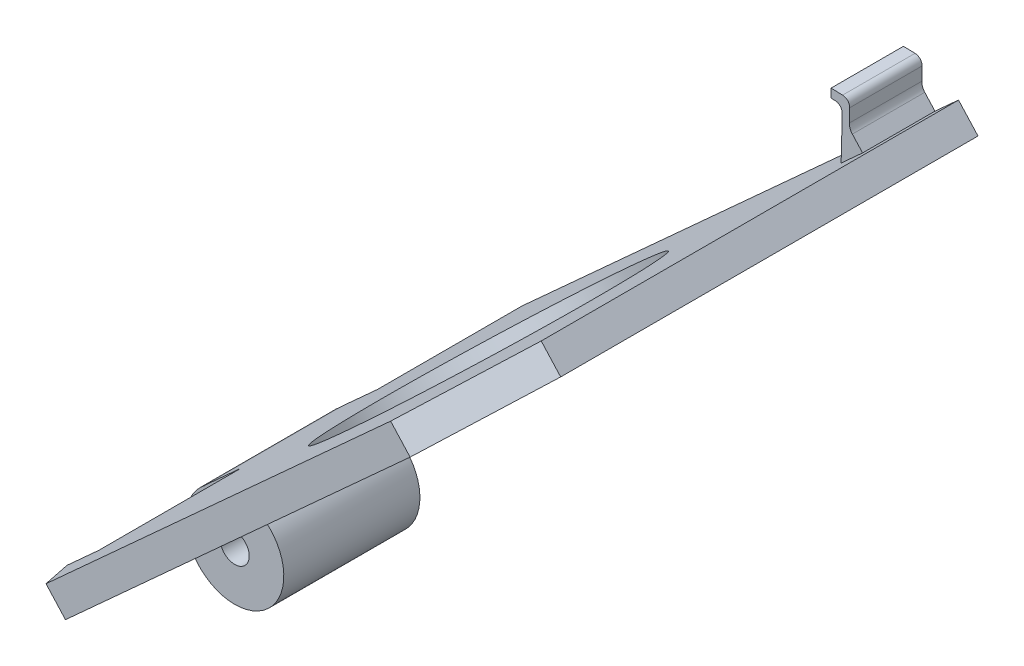
ISO-10303-21;
HEADER;
FILE_DESCRIPTION(('STEP AP214'),'2;1');
FILE_NAME('part.step','',(''),(''),'','','');
FILE_SCHEMA(('AUTOMOTIVE_DESIGN { 1 0 10303 214 1 1 1 1 }'));
ENDSEC;
DATA;
#1=APPLICATION_CONTEXT('core data for automotive mechanical design processes');
#2=APPLICATION_PROTOCOL_DEFINITION('international standard','automotive_design',2000,#1);
#3=PRODUCT_CONTEXT('',#1,'mechanical');
#4=PRODUCT('Part','Part','',(#3));
#5=PRODUCT_RELATED_PRODUCT_CATEGORY('part','',(#4));
#6=PRODUCT_DEFINITION_FORMATION('','',#4);
#7=PRODUCT_DEFINITION_CONTEXT('part definition',#1,'design');
#8=PRODUCT_DEFINITION('design','',#6,#7);
#9=PRODUCT_DEFINITION_SHAPE('','',#8);
#10=(LENGTH_UNIT() NAMED_UNIT(*) SI_UNIT(.MILLI.,.METRE.));
#11=(NAMED_UNIT(*) PLANE_ANGLE_UNIT() SI_UNIT($,.RADIAN.));
#12=(NAMED_UNIT(*) SI_UNIT($,.STERADIAN.) SOLID_ANGLE_UNIT());
#13=UNCERTAINTY_MEASURE_WITH_UNIT(LENGTH_MEASURE(1.E-05),#10,'distance_accuracy_value','');
#14=(GEOMETRIC_REPRESENTATION_CONTEXT(3) GLOBAL_UNCERTAINTY_ASSIGNED_CONTEXT((#13)) GLOBAL_UNIT_ASSIGNED_CONTEXT((#10,
#11,#12)) REPRESENTATION_CONTEXT('',''));
#15=CARTESIAN_POINT('',(0.,0.,0.));
#16=DIRECTION('',(0.,0.,1.));
#17=DIRECTION('',(1.,0.,0.));
#18=AXIS2_PLACEMENT_3D('',#15,#16,#17);
#19=CARTESIAN_POINT('',(-71.3911356861179,50.5461681079107,-19.1470894250645));
#20=DIRECTION('',(0.523355999806356,0.475498157164348,0.707106781186546));
#21=DIRECTION('',(0.803789182762831,0.,-0.594914237242193));
#22=AXIS2_PLACEMENT_3D('',#19,#20,#21);
#23=PLANE('',#22);
#24=DIRECTION('',(-0.523355999806354,-0.475498157164346,0.707106781186549));
#25=VECTOR('',#24,1.);
#26=CARTESIAN_POINT('',(-70.0462238006275,49.0658938021597,-19.1470894250645));
#27=LINE('',#26,#25);
#28=CARTESIAN_POINT('',(-70.0462238006275,49.0658938021597,-19.1470894250645));
#29=VERTEX_POINT('',#28);
#30=CARTESIAN_POINT('',(-74.4693606654794,45.0472269121251,-13.1709850670171));
#31=VERTEX_POINT('',#30);
#32=EDGE_CURVE('E288',#29,#31,#27,.T.);
#33=ORIENTED_EDGE('',*,*,#32,.F.);
#34=DIRECTION('',(0.672455942745233,-0.740137152875478,0.));
#35=VECTOR('',#34,1.);
#36=CARTESIAN_POINT('',(-71.3911356861179,50.5461681079107,-19.1470894250645));
#37=LINE('',#36,#35);
#38=CARTESIAN_POINT('',(-71.3911356861179,50.5461681079107,-19.1470894250645));
#39=VERTEX_POINT('',#38);
#40=EDGE_CURVE('E40',#39,#29,#37,.T.);
#41=ORIENTED_EDGE('',*,*,#40,.F.);
#42=DIRECTION('',(-0.523355999806354,-0.475498157164346,0.707106781186549));
#43=VECTOR('',#42,1.);
#44=CARTESIAN_POINT('',(-71.3911356861179,50.5461681079107,-19.1470894250645));
#45=LINE('',#44,#43);
#46=CARTESIAN_POINT('',(-75.8142725509698,46.5275012178761,-13.1709850670171));
#47=VERTEX_POINT('',#46);
#48=EDGE_CURVE('E289',#39,#47,#45,.T.);
#49=ORIENTED_EDGE('',*,*,#48,.T.);
#50=DIRECTION('',(0.672455942745233,-0.740137152875478,0.));
#51=VECTOR('',#50,1.);
#52=CARTESIAN_POINT('',(-75.8142725509698,46.5275012178761,-13.1709850670171));
#53=LINE('',#52,#51);
#54=EDGE_CURVE('E323',#47,#31,#53,.T.);
#55=ORIENTED_EDGE('',*,*,#54,.T.);
#56=EDGE_LOOP('',(#33,#41,#49,#55));
#57=FACE_BOUND('',#56,.T.);
#58=ADVANCED_FACE('F33',(#57),#23,.T.);
#59=CARTESIAN_POINT('',(-71.3911356861203,50.5461681079085,-47.9709850670171));
#60=DIRECTION('',(0.740137152875478,0.672455942745233,-1.11638256349546E-13));
#61=DIRECTION('',(-0.672455942745233,0.740137152875478,0.));
#62=AXIS2_PLACEMENT_3D('',#59,#60,#61);
#63=PLANE('',#62);
#64=DIRECTION('',(0.,0.,1.));
#65=VECTOR('',#64,1.);
#66=CARTESIAN_POINT('',(-70.0462238006298,49.0658938021576,-47.9709850670171));
#67=LINE('',#66,#65);
#68=CARTESIAN_POINT('',(-70.0462238006298,49.0658938021576,-47.9709850670171));
#69=VERTEX_POINT('',#68);
#70=EDGE_CURVE('E293',#69,#29,#67,.T.);
#71=ORIENTED_EDGE('',*,*,#70,.F.);
#72=DIRECTION('',(0.672455942745233,-0.740137152875478,0.));
#73=VECTOR('',#72,1.);
#74=CARTESIAN_POINT('',(-71.3911356861203,50.5461681079085,-47.9709850670171));
#75=LINE('',#74,#73);
#76=CARTESIAN_POINT('',(-71.3911356861203,50.5461681079085,-47.9709850670171));
#77=VERTEX_POINT('',#76);
#78=EDGE_CURVE('E351',#77,#69,#75,.T.);
#79=ORIENTED_EDGE('',*,*,#78,.F.);
#80=DIRECTION('',(0.,0.,1.));
#81=VECTOR('',#80,1.);
#82=CARTESIAN_POINT('',(-71.3911356861203,50.5461681079085,-47.9709850670171));
#83=LINE('',#82,#81);
#84=EDGE_CURVE('E320',#77,#39,#83,.T.);
#85=ORIENTED_EDGE('',*,*,#84,.T.);
#86=ORIENTED_EDGE('',*,*,#40,.T.);
#87=EDGE_LOOP('',(#71,#79,#85,#86));
#88=FACE_BOUND('',#87,.T.);
#89=ADVANCED_FACE('F383',(#88),#63,.T.);
#90=CARTESIAN_POINT('',(-101.532219690444,23.161309800572,-47.9709850670126));
#91=DIRECTION('',(0.,0.,-1.));
#92=DIRECTION('',(-1.,0.,0.));
#93=AXIS2_PLACEMENT_3D('',#90,#91,#92);
#94=PLANE('',#93);
#95=DIRECTION('',(0.740137152875478,0.672455942745233,-1.1126453729555E-13));
#96=VECTOR('',#95,1.);
#97=CARTESIAN_POINT('',(-100.187307804953,21.681035494821,-47.9709850670126));
#98=LINE('',#97,#96);
#99=CARTESIAN_POINT('',(-100.187307804953,21.681035494821,-47.9709850670126));
#100=VERTEX_POINT('',#99);
#101=EDGE_CURVE('E345',#100,#69,#98,.T.);
#102=ORIENTED_EDGE('',*,*,#101,.F.);
#103=DIRECTION('',(0.672455942745233,-0.740137152875478,0.));
#104=VECTOR('',#103,1.);
#105=CARTESIAN_POINT('',(-101.532219690444,23.161309800572,-47.9709850670126));
#106=LINE('',#105,#104);
#107=CARTESIAN_POINT('',(-101.532219690444,23.161309800572,-47.9709850670126));
#108=VERTEX_POINT('',#107);
#109=EDGE_CURVE('E353',#108,#100,#106,.T.);
#110=ORIENTED_EDGE('',*,*,#109,.F.);
#111=DIRECTION('',(0.740137152875478,0.672455942745233,-1.1126453729555E-13));
#112=VECTOR('',#111,1.);
#113=CARTESIAN_POINT('',(-101.532219690444,23.161309800572,-47.9709850670126));
#114=LINE('',#113,#112);
#115=CARTESIAN_POINT('',(-74.4997117281973,47.7218531483786,-47.9709850670233));
#116=VERTEX_POINT('',#115);
#117=EDGE_CURVE('E317',#108,#116,#114,.T.);
#118=ORIENTED_EDGE('',*,*,#117,.T.);
#119=DIRECTION('',(0.0255116980277722,0.999674523664447,-1.10392128959092E-13));
#120=VECTOR('',#119,1.);
#121=CARTESIAN_POINT('',(-74.422739733505,50.7379966463848,-47.9709850670236));
#122=LINE('',#121,#120);
#123=CARTESIAN_POINT('',(-74.422739733505,50.7379966463848,-47.9709850670236));
#124=VERTEX_POINT('',#123);
#125=EDGE_CURVE('E208',#116,#124,#122,.T.);
#126=ORIENTED_EDGE('',*,*,#125,.T.);
#127=CARTESIAN_POINT('',(-74.9225769953372,50.7507524953987,-47.9709850670236));
#128=DIRECTION('',(0.,1.10242506457938E-13,1.));
#129=DIRECTION('',(0.,1.,-1.10242506457938E-13));
#130=AXIS2_PLACEMENT_3D('',#127,#128,#129);
#131=CIRCLE('',#130,0.499999999999994);
#132=CARTESIAN_POINT('',(-74.9098211463233,51.2505897572309,-47.9709850670237));
#133=VERTEX_POINT('',#132);
#134=EDGE_CURVE('E233',#124,#133,#131,.T.);
#135=ORIENTED_EDGE('',*,*,#134,.T.);
#136=DIRECTION('',(-0.99967452366445,0.0255116980276584,0.));
#137=VECTOR('',#136,1.);
#138=CARTESIAN_POINT('',(-75.2099838844911,51.2582499115652,-47.9709850670237));
#139=LINE('',#138,#137);
#140=CARTESIAN_POINT('',(-75.2099838844911,51.2582499115652,-47.9709850670237));
#141=VERTEX_POINT('',#140);
#142=EDGE_CURVE('E187',#133,#141,#139,.T.);
#143=ORIENTED_EDGE('',*,*,#142,.T.);
#144=DIRECTION('',(0.0255116980277771,0.999674523664447,-1.04049531872198E-13));
#145=VECTOR('',#144,1.);
#146=CARTESIAN_POINT('',(-75.19467188198,51.8582499115652,-47.9709850670237));
#147=LINE('',#146,#145);
#148=CARTESIAN_POINT('',(-75.19467188198,51.8582499115652,-47.9709850670237));
#149=VERTEX_POINT('',#148);
#150=EDGE_CURVE('E236',#141,#149,#147,.T.);
#151=ORIENTED_EDGE('',*,*,#150,.T.);
#152=DIRECTION('',(0.999674523664448,-0.02551169802776,0.));
#153=VECTOR('',#152,1.);
#154=CARTESIAN_POINT('',(-74.39467188198,51.837833908217,-47.9709850670237));
#155=LINE('',#154,#153);
#156=CARTESIAN_POINT('',(-74.39467188198,51.837833908217,-47.9709850670237));
#157=VERTEX_POINT('',#156);
#158=EDGE_CURVE('E239',#149,#157,#155,.T.);
#159=ORIENTED_EDGE('',*,*,#158,.T.);
#160=CARTESIAN_POINT('',(-74.4074277309938,51.3379966463848,-47.9709850670237));
#161=DIRECTION('',(0.,-1.10242506457938E-13,-1.));
#162=DIRECTION('',(0.,-1.,1.10242506457938E-13));
#163=AXIS2_PLACEMENT_3D('',#160,#161,#162);
#164=CIRCLE('',#163,0.499999999999977);
#165=CARTESIAN_POINT('',(-73.9075904691616,51.3252407973709,-47.9709850670237));
#166=VERTEX_POINT('',#165);
#167=EDGE_CURVE('E242',#157,#166,#164,.T.);
#168=ORIENTED_EDGE('',*,*,#167,.T.);
#169=DIRECTION('',(-0.0255116980277735,-0.999674523664447,1.12473745506929E-13));
#170=VECTOR('',#169,1.);
#171=CARTESIAN_POINT('',(-73.9311990408944,50.4001401758593,-47.9709850670236));
#172=LINE('',#171,#170);
#173=CARTESIAN_POINT('',(-73.9311990408944,50.4001401758593,-47.9709850670236));
#174=VERTEX_POINT('',#173);
#175=EDGE_CURVE('E245',#166,#174,#172,.T.);
#176=ORIENTED_EDGE('',*,*,#175,.T.);
#177=CARTESIAN_POINT('',(-73.1314594219628,50.3797308174371,-47.9709850670236));
#178=DIRECTION('',(0.,1.10242506457938E-13,1.));
#179=DIRECTION('',(0.,1.,-1.10242506457938E-13));
#180=AXIS2_PLACEMENT_3D('',#177,#178,#179);
#181=CIRCLE('',#180,0.800000000000003);
#182=CARTESIAN_POINT('',(-73.7235691442632,49.8417660632409,-47.9709850670235));
#183=VERTEX_POINT('',#182);
#184=EDGE_CURVE('E248',#174,#183,#181,.T.);
#185=ORIENTED_EDGE('',*,*,#184,.T.);
#186=DIRECTION('',(0.672455942745235,-0.740137152875477,0.));
#187=VECTOR('',#186,1.);
#188=CARTESIAN_POINT('',(-73.7235691442632,49.8417660632409,-47.9709850670235));
#189=LINE('',#188,#187);
#190=CARTESIAN_POINT('',(-73.0194374224464,49.066765033869,-47.9709850670168));
#191=VERTEX_POINT('',#190);
#192=EDGE_CURVE('E47',#183,#191,#189,.T.);
#193=ORIENTED_EDGE('',*,*,#192,.T.);
#194=EDGE_CURVE('E316',#191,#77,#114,.T.);
#195=ORIENTED_EDGE('',*,*,#194,.T.);
#196=ORIENTED_EDGE('',*,*,#78,.T.);
#197=EDGE_LOOP('',(#102,#110,#118,#126,#135,#143,#151,#159,#168,#176,#185,#193,#195,#196));
#198=FACE_BOUND('',#197,.T.);
#199=ADVANCED_FACE('F418',(#198),#94,.T.);
#200=CARTESIAN_POINT('',(-101.532219690443,23.1613098005727,-37.9709850670175));
#201=DIRECTION('',(-0.740137152875478,-0.672455942745233,1.10995536273161E-13));
#202=DIRECTION('',(0.672455942745233,-0.740137152875478,0.));
#203=AXIS2_PLACEMENT_3D('',#200,#201,#202);
#204=PLANE('',#203);
#205=DIRECTION('',(0.,0.,-1.));
#206=VECTOR('',#205,1.);
#207=CARTESIAN_POINT('',(-100.187307804952,21.6810354948217,-37.9709850670175));
#208=LINE('',#207,#206);
#209=CARTESIAN_POINT('',(-100.187307804952,21.6810354948217,-37.9709850670175));
#210=VERTEX_POINT('',#209);
#211=EDGE_CURVE('E342',#210,#100,#208,.T.);
#212=ORIENTED_EDGE('',*,*,#211,.F.);
#213=DIRECTION('',(0.672455942745233,-0.740137152875478,0.));
#214=VECTOR('',#213,1.);
#215=CARTESIAN_POINT('',(-101.532219690443,23.1613098005727,-37.9709850670175));
#216=LINE('',#215,#214);
#217=CARTESIAN_POINT('',(-101.532219690443,23.1613098005727,-37.9709850670175));
#218=VERTEX_POINT('',#217);
#219=EDGE_CURVE('E355',#218,#210,#216,.T.);
#220=ORIENTED_EDGE('',*,*,#219,.F.);
#221=DIRECTION('',(0.,0.,-1.));
#222=VECTOR('',#221,1.);
#223=CARTESIAN_POINT('',(-101.532219690443,23.1613098005727,-37.9709850670175));
#224=LINE('',#223,#222);
#225=EDGE_CURVE('E313',#218,#108,#224,.T.);
#226=ORIENTED_EDGE('',*,*,#225,.T.);
#227=ORIENTED_EDGE('',*,*,#109,.T.);
#228=EDGE_LOOP('',(#212,#220,#226,#227));
#229=FACE_BOUND('',#228,.T.);
#230=ADVANCED_FACE('F415',(#229),#204,.T.);
#231=CARTESIAN_POINT('',(-104.041309632473,20.8816614464192,-37.9709850670172));
#232=DIRECTION('',(0.,0.,-1.));
#233=DIRECTION('',(-1.,0.,0.));
#234=AXIS2_PLACEMENT_3D('',#231,#232,#233);
#235=PLANE('',#234);
#236=DIRECTION('',(0.740137152875478,0.672455942745234,-1.10529952304273E-13));
#237=VECTOR('',#236,1.);
#238=CARTESIAN_POINT('',(-102.696397746982,19.4013871406683,-37.9709850670172));
#239=LINE('',#238,#237);
#240=CARTESIAN_POINT('',(-100.629492488712,21.2792860119995,-37.9709850670175));
#241=VERTEX_POINT('',#240);
#242=EDGE_CURVE('E340',#241,#210,#239,.T.);
#243=ORIENTED_EDGE('',*,*,#242,.F.);
#244=CARTESIAN_POINT('',(-101.983702424181,18.1708347215678,-37.9709850670241));
#245=DIRECTION('',(0.,0.,-1.));
#246=DIRECTION('',(-1.,0.,0.));
#247=AXIS2_PLACEMENT_3D('',#244,#245,#246);
#248=CIRCLE('',#247,3.3906273717867);
#249=CARTESIAN_POINT('',(-104.032766513735,20.8722584815894,-37.9709850670172));
#250=VERTEX_POINT('',#249);
#251=EDGE_CURVE('E275',#241,#250,#248,.T.);
#252=ORIENTED_EDGE('',*,*,#251,.T.);
#253=DIRECTION('',(0.672455942745233,-0.740137152875478,0.));
#254=VECTOR('',#253,1.);
#255=CARTESIAN_POINT('',(-104.041309632473,20.8816614464192,-37.9709850670172));
#256=LINE('',#255,#254);
#257=CARTESIAN_POINT('',(-104.041309632473,20.8816614464192,-37.9709850670172));
#258=VERTEX_POINT('',#257);
#259=EDGE_CURVE('E55',#258,#250,#256,.T.);
#260=ORIENTED_EDGE('',*,*,#259,.F.);
#261=DIRECTION('',(0.740137152875478,0.672455942745234,-1.10529952304273E-13));
#262=VECTOR('',#261,1.);
#263=CARTESIAN_POINT('',(-104.041309632473,20.8816614464192,-37.9709850670172));
#264=LINE('',#263,#262);
#265=EDGE_CURVE('E310',#258,#218,#264,.T.);
#266=ORIENTED_EDGE('',*,*,#265,.T.);
#267=ORIENTED_EDGE('',*,*,#219,.T.);
#268=EDGE_LOOP('',(#243,#252,#260,#266,#267));
#269=FACE_BOUND('',#268,.T.);
#270=CARTESIAN_POINT('',(-101.983702424181,18.1708347215678,-37.9709850670241));
#271=DIRECTION('',(0.,0.,-1.));
#272=DIRECTION('',(-1.,0.,0.));
#273=AXIS2_PLACEMENT_3D('',#270,#271,#272);
#274=CIRCLE('',#273,0.999999999996748);
#275=CARTESIAN_POINT('',(-102.983702424178,18.1708347215678,-37.9709850670241));
#276=VERTEX_POINT('',#275);
#277=EDGE_CURVE('E279',#276,#276,#274,.T.);
#278=ORIENTED_EDGE('',*,*,#277,.F.);
#279=EDGE_LOOP('',(#278));
#280=FACE_BOUND('',#279,.T.);
#281=ADVANCED_FACE('F410',(#269,#280),#235,.T.);
#282=CARTESIAN_POINT('',(-104.041309632472,20.8816614464199,-28.5709850670172));
#283=DIRECTION('',(-0.740137152875478,-0.672455942745233,1.1132747452871E-13));
#284=DIRECTION('',(0.672455942745233,-0.740137152875478,0.));
#285=AXIS2_PLACEMENT_3D('',#282,#283,#284);
#286=PLANE('',#285);
#287=DIRECTION('',(0.,0.,-1.));
#288=VECTOR('',#287,1.);
#289=CARTESIAN_POINT('',(-104.032766513733,20.8722584815907,-18.9808426387488));
#290=LINE('',#289,#288);
#291=CARTESIAN_POINT('',(-104.032766513734,20.87225848159,-28.5709850670172));
#292=VERTEX_POINT('',#291);
#293=EDGE_CURVE('E284',#292,#250,#290,.T.);
#294=ORIENTED_EDGE('',*,*,#293,.F.);
#295=DIRECTION('',(0.672455942745233,-0.740137152875478,0.));
#296=VECTOR('',#295,1.);
#297=CARTESIAN_POINT('',(-104.041309632472,20.8816614464199,-28.5709850670172));
#298=LINE('',#297,#296);
#299=CARTESIAN_POINT('',(-104.041309632472,20.8816614464199,-28.5709850670172));
#300=VERTEX_POINT('',#299);
#301=EDGE_CURVE('E359',#300,#292,#298,.T.);
#302=ORIENTED_EDGE('',*,*,#301,.F.);
#303=DIRECTION('',(0.,0.,-1.));
#304=VECTOR('',#303,1.);
#305=CARTESIAN_POINT('',(-104.041309632472,20.8816614464199,-28.5709850670172));
#306=LINE('',#305,#304);
#307=EDGE_CURVE('E308',#300,#258,#306,.T.);
#308=ORIENTED_EDGE('',*,*,#307,.T.);
#309=ORIENTED_EDGE('',*,*,#259,.T.);
#310=EDGE_LOOP('',(#294,#302,#308,#309));
#311=FACE_BOUND('',#310,.T.);
#312=ADVANCED_FACE('F444',(#311),#286,.T.);
#313=CARTESIAN_POINT('',(-101.532219690442,23.1613098005734,-28.5709850670175));
#314=DIRECTION('',(0.,0.,1.));
#315=DIRECTION('',(1.,0.,0.));
#316=AXIS2_PLACEMENT_3D('',#313,#314,#315);
#317=PLANE('',#316);
#318=ORIENTED_EDGE('',*,*,#301,.T.);
#319=CARTESIAN_POINT('',(-101.983702424181,18.1708347215678,-28.5709850670171));
#320=DIRECTION('',(0.,0.,1.));
#321=DIRECTION('',(1.,0.,0.));
#322=AXIS2_PLACEMENT_3D('',#319,#320,#321);
#323=CIRCLE('',#322,3.3906273717867);
#324=CARTESIAN_POINT('',(-100.629492488712,21.2792860119995,-28.5709850670175));
#325=VERTEX_POINT('',#324);
#326=EDGE_CURVE('E272',#325,#292,#323,.F.);
#327=ORIENTED_EDGE('',*,*,#326,.F.);
#328=DIRECTION('',(-0.740137152875478,-0.672455942745234,1.11553377788572E-13));
#329=VECTOR('',#328,1.);
#330=CARTESIAN_POINT('',(-100.187307804952,21.6810354948224,-28.5709850670175));
#331=LINE('',#330,#329);
#332=CARTESIAN_POINT('',(-100.187307804952,21.6810354948224,-28.5709850670175));
#333=VERTEX_POINT('',#332);
#334=EDGE_CURVE('E338',#333,#325,#331,.T.);
#335=ORIENTED_EDGE('',*,*,#334,.F.);
#336=DIRECTION('',(0.672455942745233,-0.740137152875478,0.));
#337=VECTOR('',#336,1.);
#338=CARTESIAN_POINT('',(-101.532219690442,23.1613098005734,-28.5709850670175));
#339=LINE('',#338,#337);
#340=CARTESIAN_POINT('',(-101.532219690442,23.1613098005734,-28.5709850670175));
#341=VERTEX_POINT('',#340);
#342=EDGE_CURVE('E362',#341,#333,#339,.T.);
#343=ORIENTED_EDGE('',*,*,#342,.F.);
#344=DIRECTION('',(-0.740137152875478,-0.672455942745234,1.11553377788572E-13));
#345=VECTOR('',#344,1.);
#346=CARTESIAN_POINT('',(-101.532219690442,23.1613098005734,-28.5709850670175));
#347=LINE('',#346,#345);
#348=EDGE_CURVE('E305',#341,#300,#347,.T.);
#349=ORIENTED_EDGE('',*,*,#348,.T.);
#350=EDGE_LOOP('',(#318,#327,#335,#343,#349));
#351=FACE_BOUND('',#350,.T.);
#352=CARTESIAN_POINT('',(-101.983702424181,18.1708347215678,-28.5709850670171));
#353=DIRECTION('',(0.,0.,1.));
#354=DIRECTION('',(1.,0.,0.));
#355=AXIS2_PLACEMENT_3D('',#352,#353,#354);
#356=CIRCLE('',#355,0.999999999996748);
#357=CARTESIAN_POINT('',(-100.983702424184,18.1708347215678,-28.5709850670172));
#358=VERTEX_POINT('',#357);
#359=EDGE_CURVE('E278',#358,#358,#356,.F.);
#360=ORIENTED_EDGE('',*,*,#359,.T.);
#361=EDGE_LOOP('',(#360));
#362=FACE_BOUND('',#361,.T.);
#363=ADVANCED_FACE('F403',(#351,#362),#317,.T.);
#364=CARTESIAN_POINT('',(-101.532219690441,23.1613098005741,-18.7228253563447));
#365=DIRECTION('',(-0.740137152875478,-0.672455942745233,1.11190093185258E-13));
#366=DIRECTION('',(0.672455942745233,-0.740137152875478,0.));
#367=AXIS2_PLACEMENT_3D('',#364,#365,#366);
#368=PLANE('',#367);
#369=DIRECTION('',(0.,0.,-1.));
#370=VECTOR('',#369,1.);
#371=CARTESIAN_POINT('',(-100.187307804951,21.6810354948232,-18.7228253563447));
#372=LINE('',#371,#370);
#373=CARTESIAN_POINT('',(-100.187307804951,21.6810354948232,-18.7228253563447));
#374=VERTEX_POINT('',#373);
#375=EDGE_CURVE('E335',#374,#333,#372,.T.);
#376=ORIENTED_EDGE('',*,*,#375,.F.);
#377=DIRECTION('',(0.672455942745233,-0.740137152875478,0.));
#378=VECTOR('',#377,1.);
#379=CARTESIAN_POINT('',(-101.532219690441,23.1613098005741,-18.7228253563447));
#380=LINE('',#379,#378);
#381=CARTESIAN_POINT('',(-101.532219690441,23.1613098005741,-18.7228253563447));
#382=VERTEX_POINT('',#381);
#383=EDGE_CURVE('E364',#382,#374,#380,.T.);
#384=ORIENTED_EDGE('',*,*,#383,.F.);
#385=DIRECTION('',(0.,0.,-1.));
#386=VECTOR('',#385,1.);
#387=CARTESIAN_POINT('',(-101.532219690441,23.1613098005741,-18.7228253563447));
#388=LINE('',#387,#386);
#389=EDGE_CURVE('E302',#382,#341,#388,.T.);
#390=ORIENTED_EDGE('',*,*,#389,.T.);
#391=ORIENTED_EDGE('',*,*,#342,.T.);
#392=EDGE_LOOP('',(#376,#384,#390,#391));
#393=FACE_BOUND('',#392,.T.);
#394=ADVANCED_FACE('F398',(#393),#368,.T.);
#395=CARTESIAN_POINT('',(-103.727296032584,21.1669603407225,-18.7228253563444));
#396=DIRECTION('',(0.,0.,-1.));
#397=DIRECTION('',(-1.,0.,0.));
#398=AXIS2_PLACEMENT_3D('',#395,#396,#397);
#399=PLANE('',#398);
#400=DIRECTION('',(0.740137152875478,0.672455942745234,-1.12303698881938E-13));
#401=VECTOR('',#400,1.);
#402=CARTESIAN_POINT('',(-102.382384147093,19.6866860349716,-18.7228253563444));
#403=LINE('',#402,#401);
#404=CARTESIAN_POINT('',(-102.382384147093,19.6866860349716,-18.7228253563444));
#405=VERTEX_POINT('',#404);
#406=EDGE_CURVE('E332',#405,#374,#403,.T.);
#407=ORIENTED_EDGE('',*,*,#406,.F.);
#408=DIRECTION('',(0.672455942745233,-0.740137152875478,0.));
#409=VECTOR('',#408,1.);
#410=CARTESIAN_POINT('',(-103.727296032584,21.1669603407225,-18.7228253563444));
#411=LINE('',#410,#409);
#412=CARTESIAN_POINT('',(-103.727296032584,21.1669603407225,-18.7228253563444));
#413=VERTEX_POINT('',#412);
#414=EDGE_CURVE('E366',#413,#405,#411,.T.);
#415=ORIENTED_EDGE('',*,*,#414,.F.);
#416=DIRECTION('',(0.740137152875478,0.672455942745234,-1.12303698881938E-13));
#417=VECTOR('',#416,1.);
#418=CARTESIAN_POINT('',(-103.727296032584,21.1669603407225,-18.7228253563444));
#419=LINE('',#418,#417);
#420=EDGE_CURVE('E299',#413,#382,#419,.T.);
#421=ORIENTED_EDGE('',*,*,#420,.T.);
#422=ORIENTED_EDGE('',*,*,#383,.T.);
#423=EDGE_LOOP('',(#407,#415,#421,#422));
#424=FACE_BOUND('',#423,.T.);
#425=ADVANCED_FACE('F396',(#424),#399,.T.);
#426=CARTESIAN_POINT('',(-99.6181727676191,24.9003283364555,-13.1709850670135));
#427=DIRECTION('',(-0.523355999806354,-0.475498157164346,0.707106781186549));
#428=DIRECTION('',(0.803789182762834,0.,0.594914237242189));
#429=AXIS2_PLACEMENT_3D('',#426,#427,#428);
#430=PLANE('',#429);
#431=DIRECTION('',(-0.523355999806357,-0.475498157164349,-0.707106781186546));
#432=VECTOR('',#431,1.);
#433=CARTESIAN_POINT('',(-98.2732608821287,23.4200540307046,-13.1709850670135));
#434=LINE('',#433,#432);
#435=CARTESIAN_POINT('',(-98.2732608821287,23.4200540307046,-13.1709850670135));
#436=VERTEX_POINT('',#435);
#437=EDGE_CURVE('E329',#436,#405,#434,.T.);
#438=ORIENTED_EDGE('',*,*,#437,.F.);
#439=DIRECTION('',(0.672455942745233,-0.740137152875478,0.));
#440=VECTOR('',#439,1.);
#441=CARTESIAN_POINT('',(-99.6181727676191,24.9003283364555,-13.1709850670135));
#442=LINE('',#441,#440);
#443=CARTESIAN_POINT('',(-99.6181727676191,24.9003283364555,-13.1709850670135));
#444=VERTEX_POINT('',#443);
#445=EDGE_CURVE('E368',#444,#436,#442,.T.);
#446=ORIENTED_EDGE('',*,*,#445,.F.);
#447=DIRECTION('',(-0.523355999806357,-0.475498157164349,-0.707106781186546));
#448=VECTOR('',#447,1.);
#449=CARTESIAN_POINT('',(-99.6181727676191,24.9003283364555,-13.1709850670135));
#450=LINE('',#449,#448);
#451=EDGE_CURVE('E296',#444,#413,#450,.T.);
#452=ORIENTED_EDGE('',*,*,#451,.T.);
#453=ORIENTED_EDGE('',*,*,#414,.T.);
#454=EDGE_LOOP('',(#438,#446,#452,#453));
#455=FACE_BOUND('',#454,.T.);
#456=ADVANCED_FACE('F392',(#455),#430,.T.);
#457=CARTESIAN_POINT('',(-75.8142725509698,46.5275012178761,-13.1709850670171));
#458=DIRECTION('',(0.,0.,1.));
#459=DIRECTION('',(1.,0.,0.));
#460=AXIS2_PLACEMENT_3D('',#457,#458,#459);
#461=PLANE('',#460);
#462=DIRECTION('',(-0.740137152875479,-0.672455942745233,1.11435779950694E-13));
#463=VECTOR('',#462,1.);
#464=CARTESIAN_POINT('',(-74.4693606654794,45.0472269121251,-13.1709850670171));
#465=LINE('',#464,#463);
#466=EDGE_CURVE('E326',#31,#436,#465,.T.);
#467=ORIENTED_EDGE('',*,*,#466,.F.);
#468=ORIENTED_EDGE('',*,*,#54,.F.);
#469=DIRECTION('',(-0.740137152875479,-0.672455942745233,1.11435779950694E-13));
#470=VECTOR('',#469,1.);
#471=CARTESIAN_POINT('',(-75.8142725509698,46.5275012178761,-13.1709850670171));
#472=LINE('',#471,#470);
#473=EDGE_CURVE('E292',#47,#444,#472,.T.);
#474=ORIENTED_EDGE('',*,*,#473,.T.);
#475=ORIENTED_EDGE('',*,*,#445,.T.);
#476=EDGE_LOOP('',(#467,#468,#474,#475));
#477=FACE_BOUND('',#476,.T.);
#478=ADVANCED_FACE('F375',(#477),#461,.T.);
#479=CARTESIAN_POINT('',(-57.440171492238,63.2213982902535,0.));
#480=DIRECTION('',(0.672455942745233,-0.740137152875479,0.));
#481=DIRECTION('',(0.740137152875479,0.672455942745233,0.));
#482=AXIS2_PLACEMENT_3D('',#479,#480,#481);
#483=PLANE('',#482);
#484=CARTESIAN_POINT('',(-86.4616776882818,36.8537389542404,-30.5709850670149));
#485=DIRECTION('',(0.672455942745233,-0.740137152875479,0.));
#486=DIRECTION('',(0.740137152875479,0.672455942745233,0.));
#487=AXIS2_PLACEMENT_3D('',#484,#485,#486);
#488=CIRCLE('',#487,10.);
#489=CARTESIAN_POINT('',(-79.060306159527,43.5782983816927,-30.5709850670149));
#490=VERTEX_POINT('',#489);
#491=EDGE_CURVE('E269',#490,#490,#488,.T.);
#492=ORIENTED_EDGE('',*,*,#491,.T.);
#493=EDGE_LOOP('',(#492));
#494=FACE_BOUND('',#493,.T.);
#495=DIRECTION('',(-0.740137152875481,-0.672455942745231,0.));
#496=VECTOR('',#495,1.);
#497=CARTESIAN_POINT('',(-73.0194374224463,49.0667650338696,-42.9709850670235));
#498=LINE('',#497,#496);
#499=CARTESIAN_POINT('',(-73.0194374224463,49.0667650338696,-42.9709850670235));
#500=VERTEX_POINT('',#499);
#501=CARTESIAN_POINT('',(-74.4997117281973,47.7218531483791,-42.9709850670233));
#502=VERTEX_POINT('',#501);
#503=EDGE_CURVE('E229',#500,#502,#498,.T.);
#504=ORIENTED_EDGE('',*,*,#503,.T.);
#505=DIRECTION('',(0.,-1.10242506457938E-13,-1.));
#506=VECTOR('',#505,1.);
#507=CARTESIAN_POINT('',(-74.4997117281973,47.7218531483791,-42.9709850670233));
#508=LINE('',#507,#506);
#509=EDGE_CURVE('E253',#502,#116,#508,.T.);
#510=ORIENTED_EDGE('',*,*,#509,.T.);
#511=ORIENTED_EDGE('',*,*,#117,.F.);
#512=ORIENTED_EDGE('',*,*,#225,.F.);
#513=ORIENTED_EDGE('',*,*,#265,.F.);
#514=ORIENTED_EDGE('',*,*,#307,.F.);
#515=ORIENTED_EDGE('',*,*,#348,.F.);
#516=ORIENTED_EDGE('',*,*,#389,.F.);
#517=ORIENTED_EDGE('',*,*,#420,.F.);
#518=ORIENTED_EDGE('',*,*,#451,.F.);
#519=ORIENTED_EDGE('',*,*,#473,.F.);
#520=ORIENTED_EDGE('',*,*,#48,.F.);
#521=ORIENTED_EDGE('',*,*,#84,.F.);
#522=ORIENTED_EDGE('',*,*,#194,.F.);
#523=DIRECTION('',(0.,-1.10242506457938E-13,-1.));
#524=VECTOR('',#523,1.);
#525=CARTESIAN_POINT('',(-73.0194374224463,49.0667650338696,-42.9709850670235));
#526=LINE('',#525,#524);
#527=EDGE_CURVE('E256',#500,#191,#526,.T.);
#528=ORIENTED_EDGE('',*,*,#527,.F.);
#529=EDGE_LOOP('',(#504,#510,#511,#512,#513,#514,#515,#516,#517,#518,#519,#520,#521,#522,#528));
#530=FACE_BOUND('',#529,.T.);
#531=ADVANCED_FACE('F386',(#494,#530),#483,.F.);
#532=CARTESIAN_POINT('',(-56.0952596067475,61.7411239845025,0.));
#533=DIRECTION('',(0.672455942745233,-0.740137152875479,0.));
#534=DIRECTION('',(0.740137152875479,0.672455942745233,0.));
#535=AXIS2_PLACEMENT_3D('',#532,#533,#534);
#536=PLANE('',#535);
#537=CARTESIAN_POINT('',(-85.1167658027913,35.3734646484894,-30.5709850670149));
#538=DIRECTION('',(0.672455942745233,-0.740137152875479,0.));
#539=DIRECTION('',(0.740137152875479,0.672455942745233,0.));
#540=AXIS2_PLACEMENT_3D('',#537,#538,#539);
#541=CIRCLE('',#540,10.);
#542=CARTESIAN_POINT('',(-77.7153942740365,42.0980240759418,-30.5709850670149));
#543=VERTEX_POINT('',#542);
#544=EDGE_CURVE('E252',#543,#543,#541,.T.);
#545=ORIENTED_EDGE('',*,*,#544,.F.);
#546=EDGE_LOOP('',(#545));
#547=FACE_BOUND('',#546,.T.);
#548=DIRECTION('',(0.,0.,-1.));
#549=VECTOR('',#548,1.);
#550=CARTESIAN_POINT('',(-100.629492488712,21.2792860119995,-18.9808426387487));
#551=LINE('',#550,#549);
#552=EDGE_CURVE('E11',#241,#325,#551,.F.);
#553=ORIENTED_EDGE('',*,*,#552,.F.);
#554=ORIENTED_EDGE('',*,*,#242,.T.);
#555=ORIENTED_EDGE('',*,*,#211,.T.);
#556=ORIENTED_EDGE('',*,*,#101,.T.);
#557=ORIENTED_EDGE('',*,*,#70,.T.);
#558=ORIENTED_EDGE('',*,*,#32,.T.);
#559=ORIENTED_EDGE('',*,*,#466,.T.);
#560=ORIENTED_EDGE('',*,*,#437,.T.);
#561=ORIENTED_EDGE('',*,*,#406,.T.);
#562=ORIENTED_EDGE('',*,*,#375,.T.);
#563=ORIENTED_EDGE('',*,*,#334,.T.);
#564=EDGE_LOOP('',(#553,#554,#555,#556,#557,#558,#559,#560,#561,#562,#563));
#565=FACE_BOUND('',#564,.T.);
#566=ADVANCED_FACE('F378',(#547,#565),#536,.T.);
#567=CARTESIAN_POINT('',(-101.983702424181,18.1708347215678,-18.9808426387487));
#568=DIRECTION('',(0.,0.,-1.));
#569=DIRECTION('',(-1.,0.,0.));
#570=AXIS2_PLACEMENT_3D('',#567,#568,#569);
#571=CYLINDRICAL_SURFACE('',#570,3.3906273717867);
#572=ORIENTED_EDGE('',*,*,#326,.T.);
#573=ORIENTED_EDGE('',*,*,#293,.T.);
#574=ORIENTED_EDGE('',*,*,#251,.F.);
#575=ORIENTED_EDGE('',*,*,#552,.T.);
#576=EDGE_LOOP('',(#572,#573,#574,#575));
#577=FACE_BOUND('',#576,.T.);
#578=ADVANCED_FACE('F408',(#577),#571,.T.);
#579=CARTESIAN_POINT('',(-101.983702424181,18.1708347215678,-18.9808426387487));
#580=DIRECTION('',(0.,0.,-1.));
#581=DIRECTION('',(-1.,0.,0.));
#582=AXIS2_PLACEMENT_3D('',#579,#580,#581);
#583=CYLINDRICAL_SURFACE('',#582,0.999999999996748);
#584=ORIENTED_EDGE('',*,*,#277,.T.);
#585=EDGE_LOOP('',(#584));
#586=FACE_BOUND('',#585,.T.);
#587=ORIENTED_EDGE('',*,*,#359,.F.);
#588=EDGE_LOOP('',(#587));
#589=FACE_BOUND('',#588,.T.);
#590=ADVANCED_FACE('F503',(#586,#589),#583,.F.);
#591=CARTESIAN_POINT('',(-86.4616776882818,36.8537389542404,-30.5709850670149));
#592=DIRECTION('',(0.672455942745233,-0.740137152875479,0.));
#593=DIRECTION('',(0.740137152875479,0.672455942745233,0.));
#594=AXIS2_PLACEMENT_3D('',#591,#592,#593);
#595=CYLINDRICAL_SURFACE('',#594,10.);
#596=ORIENTED_EDGE('',*,*,#491,.F.);
#597=EDGE_LOOP('',(#596));
#598=FACE_BOUND('',#597,.T.);
#599=ORIENTED_EDGE('',*,*,#544,.T.);
#600=EDGE_LOOP('',(#599));
#601=FACE_BOUND('',#600,.T.);
#602=ADVANCED_FACE('F513',(#598,#601),#595,.F.);
#603=CARTESIAN_POINT('',(-74.9225769953371,50.7507524953993,-42.9709850670236));
#604=DIRECTION('',(0.,-1.10242506457938E-13,-1.));
#605=DIRECTION('',(0.,1.,-1.10242506457938E-13));
#606=AXIS2_PLACEMENT_3D('',#603,#604,#605);
#607=CYLINDRICAL_SURFACE('',#606,0.499999999999994);
#608=ORIENTED_EDGE('',*,*,#134,.F.);
#609=DIRECTION('',(0.,-1.10242506457938E-13,-1.));
#610=VECTOR('',#609,1.);
#611=CARTESIAN_POINT('',(-74.4227397335049,50.7379966463854,-42.9709850670236));
#612=LINE('',#611,#610);
#613=CARTESIAN_POINT('',(-74.4227397335049,50.7379966463854,-42.9709850670236));
#614=VERTEX_POINT('',#613);
#615=EDGE_CURVE('E207',#614,#124,#612,.T.);
#616=ORIENTED_EDGE('',*,*,#615,.F.);
#617=CARTESIAN_POINT('',(-74.9225769953371,50.7507524953993,-42.9709850670236));
#618=DIRECTION('',(0.,1.10242506457938E-13,1.));
#619=DIRECTION('',(0.,1.,-1.10242506457938E-13));
#620=AXIS2_PLACEMENT_3D('',#617,#618,#619);
#621=CIRCLE('',#620,0.499999999999994);
#622=CARTESIAN_POINT('',(-74.9098211463233,51.2505897572315,-42.9709850670237));
#623=VERTEX_POINT('',#622);
#624=EDGE_CURVE('E200',#614,#623,#621,.T.);
#625=ORIENTED_EDGE('',*,*,#624,.T.);
#626=DIRECTION('',(0.,-1.10242506457938E-13,-1.));
#627=VECTOR('',#626,1.);
#628=CARTESIAN_POINT('',(-74.9098211463233,51.2505897572315,-42.9709850670237));
#629=LINE('',#628,#627);
#630=EDGE_CURVE('E182',#623,#133,#629,.T.);
#631=ORIENTED_EDGE('',*,*,#630,.T.);
#632=EDGE_LOOP('',(#608,#616,#625,#631));
#633=FACE_BOUND('',#632,.T.);
#634=ADVANCED_FACE('F206',(#633),#607,.F.);
#635=CARTESIAN_POINT('',(-74.4227397335049,50.7379966463854,-42.9709850670236));
#636=DIRECTION('',(-0.999674523664447,0.0255116980277722,0.));
#637=DIRECTION('',(-0.0255116980277722,-0.999674523664447,0.));
#638=AXIS2_PLACEMENT_3D('',#635,#636,#637);
#639=PLANE('',#638);
#640=ORIENTED_EDGE('',*,*,#125,.F.);
#641=ORIENTED_EDGE('',*,*,#509,.F.);
#642=DIRECTION('',(0.0255116980277722,0.999674523664447,-1.10392128959092E-13));
#643=VECTOR('',#642,1.);
#644=CARTESIAN_POINT('',(-74.4227397335049,50.7379966463854,-42.9709850670236));
#645=LINE('',#644,#643);
#646=EDGE_CURVE('E193',#502,#614,#645,.T.);
#647=ORIENTED_EDGE('',*,*,#646,.T.);
#648=ORIENTED_EDGE('',*,*,#615,.T.);
#649=EDGE_LOOP('',(#640,#641,#647,#648));
#650=FACE_BOUND('',#649,.T.);
#651=ADVANCED_FACE('F442',(#650),#639,.T.);
#652=CARTESIAN_POINT('',(-73.7235691442631,49.8417660632415,-42.9709850670235));
#653=DIRECTION('',(0.740137152875477,0.672455942745235,0.));
#654=DIRECTION('',(-0.672455942745235,0.740137152875477,0.));
#655=AXIS2_PLACEMENT_3D('',#652,#653,#654);
#656=PLANE('',#655);
#657=ORIENTED_EDGE('',*,*,#192,.F.);
#658=DIRECTION('',(0.,-1.10242506457938E-13,-1.));
#659=VECTOR('',#658,1.);
#660=CARTESIAN_POINT('',(-73.7235691442631,49.8417660632415,-42.9709850670235));
#661=LINE('',#660,#659);
#662=CARTESIAN_POINT('',(-73.7235691442631,49.8417660632415,-42.9709850670235));
#663=VERTEX_POINT('',#662);
#664=EDGE_CURVE('E258',#663,#183,#661,.T.);
#665=ORIENTED_EDGE('',*,*,#664,.F.);
#666=DIRECTION('',(0.672455942745235,-0.740137152875477,0.));
#667=VECTOR('',#666,1.);
#668=CARTESIAN_POINT('',(-73.7235691442631,49.8417660632415,-42.9709850670235));
#669=LINE('',#668,#667);
#670=EDGE_CURVE('E226',#663,#500,#669,.T.);
#671=ORIENTED_EDGE('',*,*,#670,.T.);
#672=ORIENTED_EDGE('',*,*,#527,.T.);
#673=EDGE_LOOP('',(#657,#665,#671,#672));
#674=FACE_BOUND('',#673,.T.);
#675=ADVANCED_FACE('F421',(#674),#656,.T.);
#676=CARTESIAN_POINT('',(-73.1314594219627,50.3797308174376,-42.9709850670236));
#677=DIRECTION('',(0.,-1.10242506457938E-13,-1.));
#678=DIRECTION('',(0.,1.,-1.10242506457938E-13));
#679=AXIS2_PLACEMENT_3D('',#676,#677,#678);
#680=CYLINDRICAL_SURFACE('',#679,0.800000000000003);
#681=ORIENTED_EDGE('',*,*,#184,.F.);
#682=DIRECTION('',(0.,-1.10242506457938E-13,-1.));
#683=VECTOR('',#682,1.);
#684=CARTESIAN_POINT('',(-73.9311990408943,50.4001401758599,-42.9709850670236));
#685=LINE('',#684,#683);
#686=CARTESIAN_POINT('',(-73.9311990408943,50.4001401758599,-42.9709850670236));
#687=VERTEX_POINT('',#686);
#688=EDGE_CURVE('E260',#687,#174,#685,.T.);
#689=ORIENTED_EDGE('',*,*,#688,.F.);
#690=CARTESIAN_POINT('',(-73.1314594219627,50.3797308174376,-42.9709850670236));
#691=DIRECTION('',(0.,1.10242506457938E-13,1.));
#692=DIRECTION('',(0.,1.,-1.10242506457938E-13));
#693=AXIS2_PLACEMENT_3D('',#690,#691,#692);
#694=CIRCLE('',#693,0.800000000000003);
#695=EDGE_CURVE('E223',#687,#663,#694,.T.);
#696=ORIENTED_EDGE('',*,*,#695,.T.);
#697=ORIENTED_EDGE('',*,*,#664,.T.);
#698=EDGE_LOOP('',(#681,#689,#696,#697));
#699=FACE_BOUND('',#698,.T.);
#700=ADVANCED_FACE('F427',(#699),#680,.F.);
#701=CARTESIAN_POINT('',(-73.9311990408943,50.4001401758599,-42.9709850670236));
#702=DIRECTION('',(0.999674523664447,-0.0255116980277735,0.));
#703=DIRECTION('',(0.0255116980277735,0.999674523664447,0.));
#704=AXIS2_PLACEMENT_3D('',#701,#702,#703);
#705=PLANE('',#704);
#706=ORIENTED_EDGE('',*,*,#175,.F.);
#707=DIRECTION('',(0.,-1.10242506457938E-13,-1.));
#708=VECTOR('',#707,1.);
#709=CARTESIAN_POINT('',(-73.9075904691615,51.3252407973715,-42.9709850670237));
#710=LINE('',#709,#708);
#711=CARTESIAN_POINT('',(-73.9075904691615,51.3252407973715,-42.9709850670237));
#712=VERTEX_POINT('',#711);
#713=EDGE_CURVE('E262',#712,#166,#710,.T.);
#714=ORIENTED_EDGE('',*,*,#713,.F.);
#715=DIRECTION('',(-0.0255116980277735,-0.999674523664447,1.12473745506929E-13));
#716=VECTOR('',#715,1.);
#717=CARTESIAN_POINT('',(-73.9311990408943,50.4001401758599,-42.9709850670236));
#718=LINE('',#717,#716);
#719=EDGE_CURVE('E220',#712,#687,#718,.T.);
#720=ORIENTED_EDGE('',*,*,#719,.T.);
#721=ORIENTED_EDGE('',*,*,#688,.T.);
#722=EDGE_LOOP('',(#706,#714,#720,#721));
#723=FACE_BOUND('',#722,.T.);
#724=ADVANCED_FACE('F430',(#723),#705,.T.);
#725=CARTESIAN_POINT('',(-74.4074277309937,51.3379966463854,-42.9709850670237));
#726=DIRECTION('',(0.,-1.10242506457938E-13,-1.));
#727=DIRECTION('',(0.,1.,-1.10242506457938E-13));
#728=AXIS2_PLACEMENT_3D('',#725,#726,#727);
#729=CYLINDRICAL_SURFACE('',#728,0.499999999999977);
#730=ORIENTED_EDGE('',*,*,#167,.F.);
#731=DIRECTION('',(0.,-1.10242506457938E-13,-1.));
#732=VECTOR('',#731,1.);
#733=CARTESIAN_POINT('',(-74.3946718819799,51.8378339082176,-42.9709850670237));
#734=LINE('',#733,#732);
#735=CARTESIAN_POINT('',(-74.3946718819799,51.8378339082176,-42.9709850670237));
#736=VERTEX_POINT('',#735);
#737=EDGE_CURVE('E264',#736,#157,#734,.T.);
#738=ORIENTED_EDGE('',*,*,#737,.F.);
#739=CARTESIAN_POINT('',(-74.4074277309937,51.3379966463854,-42.9709850670237));
#740=DIRECTION('',(0.,-1.10242506457938E-13,-1.));
#741=DIRECTION('',(0.,-1.,1.10242506457938E-13));
#742=AXIS2_PLACEMENT_3D('',#739,#740,#741);
#743=CIRCLE('',#742,0.499999999999977);
#744=EDGE_CURVE('E217',#736,#712,#743,.T.);
#745=ORIENTED_EDGE('',*,*,#744,.T.);
#746=ORIENTED_EDGE('',*,*,#713,.T.);
#747=EDGE_LOOP('',(#730,#738,#745,#746));
#748=FACE_BOUND('',#747,.T.);
#749=ADVANCED_FACE('F434',(#748),#729,.T.);
#750=CARTESIAN_POINT('',(-74.3946718819799,51.8378339082176,-42.9709850670237));
#751=DIRECTION('',(0.02551169802776,0.999674523664448,-1.1060605998443E-13));
#752=DIRECTION('',(-0.999674523664448,0.02551169802776,0.));
#753=AXIS2_PLACEMENT_3D('',#750,#751,#752);
#754=PLANE('',#753);
#755=ORIENTED_EDGE('',*,*,#158,.F.);
#756=DIRECTION('',(0.,-1.10242506457938E-13,-1.));
#757=VECTOR('',#756,1.);
#758=CARTESIAN_POINT('',(-75.1946718819799,51.8582499115658,-42.9709850670237));
#759=LINE('',#758,#757);
#760=CARTESIAN_POINT('',(-75.1946718819799,51.8582499115658,-42.9709850670237));
#761=VERTEX_POINT('',#760);
#762=EDGE_CURVE('E266',#761,#149,#759,.T.);
#763=ORIENTED_EDGE('',*,*,#762,.F.);
#764=DIRECTION('',(0.999674523664448,-0.02551169802776,0.));
#765=VECTOR('',#764,1.);
#766=CARTESIAN_POINT('',(-74.3946718819799,51.8378339082176,-42.9709850670237));
#767=LINE('',#766,#765);
#768=EDGE_CURVE('E214',#761,#736,#767,.T.);
#769=ORIENTED_EDGE('',*,*,#768,.T.);
#770=ORIENTED_EDGE('',*,*,#737,.T.);
#771=EDGE_LOOP('',(#755,#763,#769,#770));
#772=FACE_BOUND('',#771,.T.);
#773=ADVANCED_FACE('F437',(#772),#754,.T.);
#774=CARTESIAN_POINT('',(-75.1946718819799,51.8582499115658,-42.9709850670237));
#775=DIRECTION('',(-0.999674523664447,0.0255116980277771,0.));
#776=DIRECTION('',(-0.0255116980277771,-0.999674523664447,0.));
#777=AXIS2_PLACEMENT_3D('',#774,#775,#776);
#778=PLANE('',#777);
#779=ORIENTED_EDGE('',*,*,#150,.F.);
#780=DIRECTION('',(0.,-1.10242506457938E-13,-1.));
#781=VECTOR('',#780,1.);
#782=CARTESIAN_POINT('',(-75.209983884491,51.2582499115658,-42.9709850670237));
#783=LINE('',#782,#781);
#784=CARTESIAN_POINT('',(-75.209983884491,51.2582499115658,-42.9709850670237));
#785=VERTEX_POINT('',#784);
#786=EDGE_CURVE('E192',#785,#141,#783,.T.);
#787=ORIENTED_EDGE('',*,*,#786,.F.);
#788=DIRECTION('',(0.0255116980277771,0.999674523664447,-1.04049531872198E-13));
#789=VECTOR('',#788,1.);
#790=CARTESIAN_POINT('',(-75.1946718819799,51.8582499115658,-42.9709850670237));
#791=LINE('',#790,#789);
#792=EDGE_CURVE('E204',#785,#761,#791,.T.);
#793=ORIENTED_EDGE('',*,*,#792,.T.);
#794=ORIENTED_EDGE('',*,*,#762,.T.);
#795=EDGE_LOOP('',(#779,#787,#793,#794));
#796=FACE_BOUND('',#795,.T.);
#797=ADVANCED_FACE('F440',(#796),#778,.T.);
#798=CARTESIAN_POINT('',(-75.209983884491,51.2582499115658,-42.9709850670237));
#799=DIRECTION('',(-0.0255116980276584,-0.99967452366445,1.10606059984429E-13));
#800=DIRECTION('',(0.99967452366445,-0.0255116980276584,0.));
#801=AXIS2_PLACEMENT_3D('',#798,#799,#800);
#802=PLANE('',#801);
#803=ORIENTED_EDGE('',*,*,#142,.F.);
#804=ORIENTED_EDGE('',*,*,#630,.F.);
#805=DIRECTION('',(-0.99967452366445,0.0255116980276584,0.));
#806=VECTOR('',#805,1.);
#807=CARTESIAN_POINT('',(-75.209983884491,51.2582499115658,-42.9709850670237));
#808=LINE('',#807,#806);
#809=EDGE_CURVE('E185',#623,#785,#808,.T.);
#810=ORIENTED_EDGE('',*,*,#809,.T.);
#811=ORIENTED_EDGE('',*,*,#786,.T.);
#812=EDGE_LOOP('',(#803,#804,#810,#811));
#813=FACE_BOUND('',#812,.T.);
#814=ADVANCED_FACE('F184',(#813),#802,.T.);
#815=CARTESIAN_POINT('',(-74.9225769953371,50.7507524953993,-42.9709850670236));
#816=DIRECTION('',(0.,-1.10242506457938E-13,-1.));
#817=DIRECTION('',(0.,1.,-1.10242506457938E-13));
#818=AXIS2_PLACEMENT_3D('',#815,#816,#817);
#819=PLANE('',#818);
#820=ORIENTED_EDGE('',*,*,#624,.F.);
#821=ORIENTED_EDGE('',*,*,#646,.F.);
#822=ORIENTED_EDGE('',*,*,#503,.F.);
#823=ORIENTED_EDGE('',*,*,#670,.F.);
#824=ORIENTED_EDGE('',*,*,#695,.F.);
#825=ORIENTED_EDGE('',*,*,#719,.F.);
#826=ORIENTED_EDGE('',*,*,#744,.F.);
#827=ORIENTED_EDGE('',*,*,#768,.F.);
#828=ORIENTED_EDGE('',*,*,#792,.F.);
#829=ORIENTED_EDGE('',*,*,#809,.F.);
#830=EDGE_LOOP('',(#820,#821,#822,#823,#824,#825,#826,#827,#828,#829));
#831=FACE_BOUND('',#830,.T.);
#832=ADVANCED_FACE('F198',(#831),#819,.F.);
#833=CLOSED_SHELL('',(#58,#89,#199,#230,#281,#312,#363,#394,#425,#456,#478,#531,#566,#578,#590,
#602,#634,#651,#675,#700,#724,#749,#773,#797,#814,#832));
#834=MANIFOLD_SOLID_BREP('B2',#833);
#835=ADVANCED_BREP_SHAPE_REPRESENTATION('',(#18,#834),#14);
#836=SHAPE_DEFINITION_REPRESENTATION(#9,#835);
ENDSEC;
END-ISO-10303-21;
